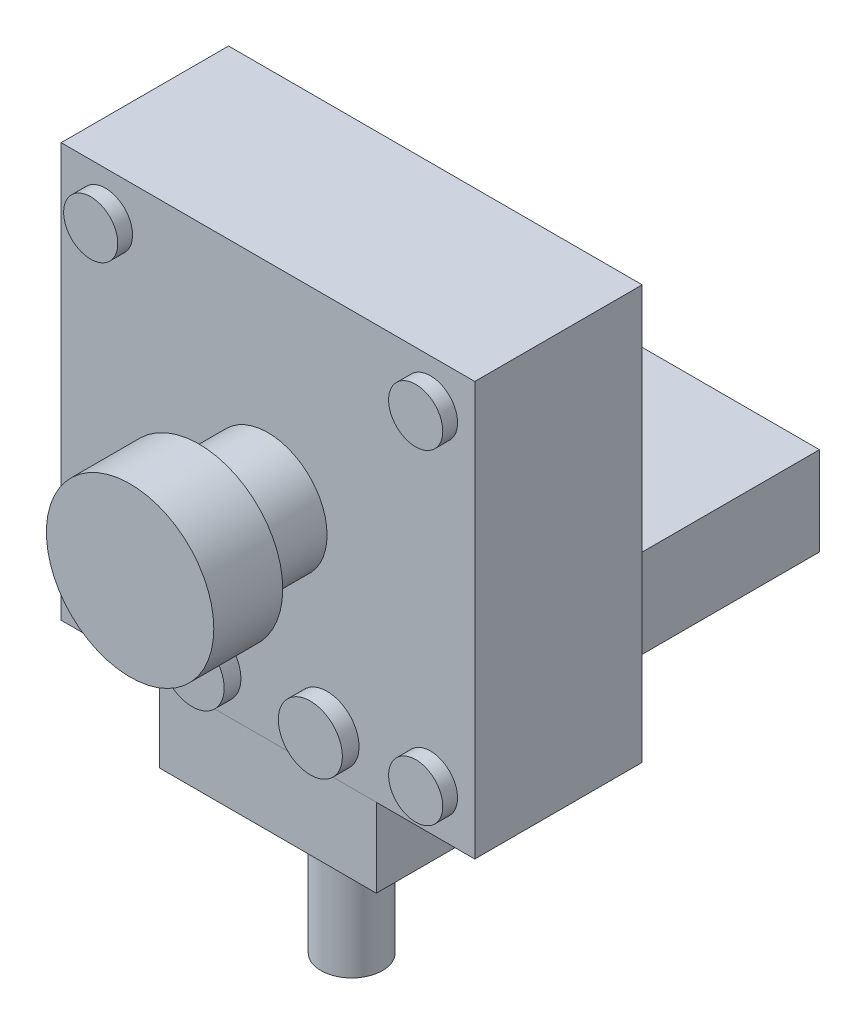
ISO-10303-21;
HEADER;
FILE_DESCRIPTION(('STEP AP214'),'2;1');
FILE_NAME('part.step','',(''),(''),'','','');
FILE_SCHEMA(('AUTOMOTIVE_DESIGN { 1 0 10303 214 1 1 1 1 }'));
ENDSEC;
DATA;
#1=APPLICATION_CONTEXT('core data for automotive mechanical design processes');
#2=APPLICATION_PROTOCOL_DEFINITION('international standard','automotive_design',2000,#1);
#3=PRODUCT_CONTEXT('',#1,'mechanical');
#4=PRODUCT('Part','Part','',(#3));
#5=PRODUCT_RELATED_PRODUCT_CATEGORY('part','',(#4));
#6=PRODUCT_DEFINITION_FORMATION('','',#4);
#7=PRODUCT_DEFINITION_CONTEXT('part definition',#1,'design');
#8=PRODUCT_DEFINITION('design','',#6,#7);
#9=PRODUCT_DEFINITION_SHAPE('','',#8);
#10=(LENGTH_UNIT() NAMED_UNIT(*) SI_UNIT(.MILLI.,.METRE.));
#11=(NAMED_UNIT(*) PLANE_ANGLE_UNIT() SI_UNIT($,.RADIAN.));
#12=(NAMED_UNIT(*) SI_UNIT($,.STERADIAN.) SOLID_ANGLE_UNIT());
#13=UNCERTAINTY_MEASURE_WITH_UNIT(LENGTH_MEASURE(1.E-05),#10,'distance_accuracy_value','');
#14=(GEOMETRIC_REPRESENTATION_CONTEXT(3) GLOBAL_UNCERTAINTY_ASSIGNED_CONTEXT((#13)) GLOBAL_UNIT_ASSIGNED_CONTEXT((#10,
#11,#12)) REPRESENTATION_CONTEXT('',''));
#15=CARTESIAN_POINT('',(0.,0.,0.));
#16=DIRECTION('',(0.,0.,1.));
#17=DIRECTION('',(1.,0.,0.));
#18=AXIS2_PLACEMENT_3D('',#15,#16,#17);
#19=CARTESIAN_POINT('',(30.5,2.75,-2.5));
#20=DIRECTION('',(-1.,0.,0.));
#21=DIRECTION('',(0.,0.,1.));
#22=AXIS2_PLACEMENT_3D('',#19,#20,#21);
#23=PLANE('',#22);
#24=DIRECTION('',(0.,-1.,0.));
#25=VECTOR('',#24,1.);
#26=CARTESIAN_POINT('',(30.5,2.75,0.));
#27=LINE('',#26,#25);
#28=CARTESIAN_POINT('',(30.5,6.25,0.));
#29=VERTEX_POINT('',#28);
#30=CARTESIAN_POINT('',(30.5,2.75,0.));
#31=VERTEX_POINT('',#30);
#32=EDGE_CURVE('E141',#29,#31,#27,.T.);
#33=ORIENTED_EDGE('',*,*,#32,.T.);
#34=DIRECTION('',(0.,0.,1.));
#35=VECTOR('',#34,1.);
#36=CARTESIAN_POINT('',(30.5,2.75,-2.5));
#37=LINE('',#36,#35);
#38=CARTESIAN_POINT('',(30.5,2.75,-2.5));
#39=VERTEX_POINT('',#38);
#40=EDGE_CURVE('E12',#39,#31,#37,.T.);
#41=ORIENTED_EDGE('',*,*,#40,.F.);
#42=DIRECTION('',(0.,-1.,0.));
#43=VECTOR('',#42,1.);
#44=CARTESIAN_POINT('',(30.5,2.75,-2.5));
#45=LINE('',#44,#43);
#46=CARTESIAN_POINT('',(30.5,6.25,-2.5));
#47=VERTEX_POINT('',#46);
#48=EDGE_CURVE('E150',#47,#39,#45,.T.);
#49=ORIENTED_EDGE('',*,*,#48,.F.);
#50=DIRECTION('',(0.,0.,1.));
#51=VECTOR('',#50,1.);
#52=CARTESIAN_POINT('',(30.5,6.25,-2.5));
#53=LINE('',#52,#51);
#54=EDGE_CURVE('E159',#47,#29,#53,.T.);
#55=ORIENTED_EDGE('',*,*,#54,.T.);
#56=EDGE_LOOP('',(#33,#41,#49,#55));
#57=FACE_BOUND('',#56,.T.);
#58=ADVANCED_FACE('F43',(#57),#23,.F.);
#59=CARTESIAN_POINT('',(30.5,2.75,-2.5));
#60=DIRECTION('',(0.,1.,0.));
#61=DIRECTION('',(0.,0.,1.));
#62=AXIS2_PLACEMENT_3D('',#59,#60,#61);
#63=PLANE('',#62);
#64=DIRECTION('',(-1.,0.,0.));
#65=VECTOR('',#64,1.);
#66=CARTESIAN_POINT('',(30.5,2.75,0.));
#67=LINE('',#66,#65);
#68=CARTESIAN_POINT('',(11.5,2.75,0.));
#69=VERTEX_POINT('',#68);
#70=EDGE_CURVE('E144',#31,#69,#67,.T.);
#71=ORIENTED_EDGE('',*,*,#70,.T.);
#72=DIRECTION('',(0.,0.,1.));
#73=VECTOR('',#72,1.);
#74=CARTESIAN_POINT('',(11.5,2.75,-2.5));
#75=LINE('',#74,#73);
#76=CARTESIAN_POINT('',(11.5,2.75,-2.5));
#77=VERTEX_POINT('',#76);
#78=EDGE_CURVE('E51',#77,#69,#75,.T.);
#79=ORIENTED_EDGE('',*,*,#78,.F.);
#80=DIRECTION('',(-1.,0.,0.));
#81=VECTOR('',#80,1.);
#82=CARTESIAN_POINT('',(30.5,2.75,-2.5));
#83=LINE('',#82,#81);
#84=EDGE_CURVE('E85',#39,#77,#83,.T.);
#85=ORIENTED_EDGE('',*,*,#84,.F.);
#86=ORIENTED_EDGE('',*,*,#40,.T.);
#87=EDGE_LOOP('',(#71,#79,#85,#86));
#88=FACE_BOUND('',#87,.T.);
#89=ADVANCED_FACE('F203',(#88),#63,.F.);
#90=CARTESIAN_POINT('',(11.5,2.75,-2.5));
#91=DIRECTION('',(1.,0.,0.));
#92=DIRECTION('',(0.,0.,-1.));
#93=AXIS2_PLACEMENT_3D('',#90,#91,#92);
#94=PLANE('',#93);
#95=DIRECTION('',(0.,1.,0.));
#96=VECTOR('',#95,1.);
#97=CARTESIAN_POINT('',(11.5,2.75,0.));
#98=LINE('',#97,#96);
#99=CARTESIAN_POINT('',(11.5,6.25,0.));
#100=VERTEX_POINT('',#99);
#101=EDGE_CURVE('E75',#69,#100,#98,.T.);
#102=ORIENTED_EDGE('',*,*,#101,.T.);
#103=DIRECTION('',(0.,0.,1.));
#104=VECTOR('',#103,1.);
#105=CARTESIAN_POINT('',(11.5,6.25,-2.5));
#106=LINE('',#105,#104);
#107=CARTESIAN_POINT('',(11.5,6.25,-2.5));
#108=VERTEX_POINT('',#107);
#109=EDGE_CURVE('E59',#108,#100,#106,.T.);
#110=ORIENTED_EDGE('',*,*,#109,.F.);
#111=DIRECTION('',(0.,1.,0.));
#112=VECTOR('',#111,1.);
#113=CARTESIAN_POINT('',(11.5,2.75,-2.5));
#114=LINE('',#113,#112);
#115=EDGE_CURVE('E154',#77,#108,#114,.T.);
#116=ORIENTED_EDGE('',*,*,#115,.F.);
#117=ORIENTED_EDGE('',*,*,#78,.T.);
#118=EDGE_LOOP('',(#102,#110,#116,#117));
#119=FACE_BOUND('',#118,.T.);
#120=ADVANCED_FACE('F165',(#119),#94,.F.);
#121=CARTESIAN_POINT('',(30.5,6.25,-2.5));
#122=DIRECTION('',(0.,-1.,0.));
#123=DIRECTION('',(0.,0.,-1.));
#124=AXIS2_PLACEMENT_3D('',#121,#122,#123);
#125=PLANE('',#124);
#126=DIRECTION('',(1.,0.,0.));
#127=VECTOR('',#126,1.);
#128=CARTESIAN_POINT('',(30.5,6.25,0.));
#129=LINE('',#128,#127);
#130=EDGE_CURVE('E80',#100,#29,#129,.T.);
#131=ORIENTED_EDGE('',*,*,#130,.T.);
#132=ORIENTED_EDGE('',*,*,#54,.F.);
#133=DIRECTION('',(1.,0.,0.));
#134=VECTOR('',#133,1.);
#135=CARTESIAN_POINT('',(30.5,6.25,-2.5));
#136=LINE('',#135,#134);
#137=EDGE_CURVE('E157',#108,#47,#136,.T.);
#138=ORIENTED_EDGE('',*,*,#137,.F.);
#139=ORIENTED_EDGE('',*,*,#109,.T.);
#140=EDGE_LOOP('',(#131,#132,#138,#139));
#141=FACE_BOUND('',#140,.T.);
#142=ADVANCED_FACE('F170',(#141),#125,.F.);
#143=CARTESIAN_POINT('',(0.,0.,0.));
#144=DIRECTION('',(0.,0.,1.));
#145=DIRECTION('',(1.,0.,0.));
#146=AXIS2_PLACEMENT_3D('',#143,#144,#145);
#147=PLANE('',#146);
#148=ORIENTED_EDGE('',*,*,#32,.F.);
#149=ORIENTED_EDGE('',*,*,#130,.F.);
#150=ORIENTED_EDGE('',*,*,#101,.F.);
#151=ORIENTED_EDGE('',*,*,#70,.F.);
#152=EDGE_LOOP('',(#148,#149,#150,#151));
#153=FACE_BOUND('',#152,.T.);
#154=ADVANCED_FACE('F168',(#153),#147,.T.);
#155=CARTESIAN_POINT('',(9.5,0.,-27.5));
#156=DIRECTION('',(1.,0.,0.));
#157=DIRECTION('',(0.,0.,-1.));
#158=AXIS2_PLACEMENT_3D('',#155,#156,#157);
#159=PLANE('',#158);
#160=DIRECTION('',(0.,1.,0.));
#161=VECTOR('',#160,1.);
#162=CARTESIAN_POINT('',(9.5,0.,-2.5));
#163=LINE('',#162,#161);
#164=CARTESIAN_POINT('',(9.5,0.,-2.5));
#165=VERTEX_POINT('',#164);
#166=CARTESIAN_POINT('',(9.5,8.99999999999999,-2.5));
#167=VERTEX_POINT('',#166);
#168=EDGE_CURVE('E140',#165,#167,#163,.T.);
#169=ORIENTED_EDGE('',*,*,#168,.T.);
#170=DIRECTION('',(0.,0.,1.));
#171=VECTOR('',#170,1.);
#172=CARTESIAN_POINT('',(9.5,8.99999999999999,-27.5));
#173=LINE('',#172,#171);
#174=CARTESIAN_POINT('',(9.5,8.99999999999999,-27.5));
#175=VERTEX_POINT('',#174);
#176=EDGE_CURVE('E120',#175,#167,#173,.T.);
#177=ORIENTED_EDGE('',*,*,#176,.F.);
#178=DIRECTION('',(0.,1.,0.));
#179=VECTOR('',#178,1.);
#180=CARTESIAN_POINT('',(9.5,0.,-27.5));
#181=LINE('',#180,#179);
#182=CARTESIAN_POINT('',(9.5,0.,-27.5));
#183=VERTEX_POINT('',#182);
#184=EDGE_CURVE('E127',#183,#175,#181,.T.);
#185=ORIENTED_EDGE('',*,*,#184,.F.);
#186=DIRECTION('',(0.,0.,1.));
#187=VECTOR('',#186,1.);
#188=CARTESIAN_POINT('',(9.5,0.,-27.5));
#189=LINE('',#188,#187);
#190=EDGE_CURVE('E187',#183,#165,#189,.T.);
#191=ORIENTED_EDGE('',*,*,#190,.T.);
#192=EDGE_LOOP('',(#169,#177,#185,#191));
#193=FACE_BOUND('',#192,.T.);
#194=ADVANCED_FACE('F138',(#193),#159,.F.);
#195=CARTESIAN_POINT('',(32.5,8.99999999999999,-27.5));
#196=DIRECTION('',(0.,-1.,0.));
#197=DIRECTION('',(0.,0.,-1.));
#198=AXIS2_PLACEMENT_3D('',#195,#196,#197);
#199=PLANE('',#198);
#200=DIRECTION('',(1.,0.,0.));
#201=VECTOR('',#200,1.);
#202=CARTESIAN_POINT('',(32.5,8.99999999999999,-2.5));
#203=LINE('',#202,#201);
#204=CARTESIAN_POINT('',(32.5,8.99999999999999,-2.5));
#205=VERTEX_POINT('',#204);
#206=EDGE_CURVE('E178',#167,#205,#203,.T.);
#207=ORIENTED_EDGE('',*,*,#206,.T.);
#208=DIRECTION('',(0.,0.,1.));
#209=VECTOR('',#208,1.);
#210=CARTESIAN_POINT('',(32.5,8.99999999999999,-27.5));
#211=LINE('',#210,#209);
#212=CARTESIAN_POINT('',(32.5,8.99999999999999,-27.5));
#213=VERTEX_POINT('',#212);
#214=EDGE_CURVE('E123',#213,#205,#211,.T.);
#215=ORIENTED_EDGE('',*,*,#214,.F.);
#216=DIRECTION('',(1.,0.,0.));
#217=VECTOR('',#216,1.);
#218=CARTESIAN_POINT('',(32.5,8.99999999999999,-27.5));
#219=LINE('',#218,#217);
#220=EDGE_CURVE('E116',#175,#213,#219,.T.);
#221=ORIENTED_EDGE('',*,*,#220,.F.);
#222=ORIENTED_EDGE('',*,*,#176,.T.);
#223=EDGE_LOOP('',(#207,#215,#221,#222));
#224=FACE_BOUND('',#223,.T.);
#225=ADVANCED_FACE('F118',(#224),#199,.F.);
#226=CARTESIAN_POINT('',(32.5,0.,-27.5));
#227=DIRECTION('',(-1.,0.,0.));
#228=DIRECTION('',(0.,0.,1.));
#229=AXIS2_PLACEMENT_3D('',#226,#227,#228);
#230=PLANE('',#229);
#231=DIRECTION('',(0.,-1.,0.));
#232=VECTOR('',#231,1.);
#233=CARTESIAN_POINT('',(32.5,0.,-2.5));
#234=LINE('',#233,#232);
#235=CARTESIAN_POINT('',(32.5,0.,-2.5));
#236=VERTEX_POINT('',#235);
#237=EDGE_CURVE('E180',#205,#236,#234,.T.);
#238=ORIENTED_EDGE('',*,*,#237,.T.);
#239=DIRECTION('',(0.,0.,1.));
#240=VECTOR('',#239,1.);
#241=CARTESIAN_POINT('',(32.5,0.,-27.5));
#242=LINE('',#241,#240);
#243=CARTESIAN_POINT('',(32.5,0.,-27.5));
#244=VERTEX_POINT('',#243);
#245=EDGE_CURVE('E146',#244,#236,#242,.T.);
#246=ORIENTED_EDGE('',*,*,#245,.F.);
#247=DIRECTION('',(0.,-1.,0.));
#248=VECTOR('',#247,1.);
#249=CARTESIAN_POINT('',(32.5,0.,-27.5));
#250=LINE('',#249,#248);
#251=EDGE_CURVE('E126',#213,#244,#250,.T.);
#252=ORIENTED_EDGE('',*,*,#251,.F.);
#253=ORIENTED_EDGE('',*,*,#214,.T.);
#254=EDGE_LOOP('',(#238,#246,#252,#253));
#255=FACE_BOUND('',#254,.T.);
#256=ADVANCED_FACE('F193',(#255),#230,.F.);
#257=CARTESIAN_POINT('',(32.5,0.,-27.5));
#258=DIRECTION('',(0.,1.,0.));
#259=DIRECTION('',(0.,0.,1.));
#260=AXIS2_PLACEMENT_3D('',#257,#258,#259);
#261=PLANE('',#260);
#262=DIRECTION('',(-1.,0.,0.));
#263=VECTOR('',#262,1.);
#264=CARTESIAN_POINT('',(32.5,0.,-2.5));
#265=LINE('',#264,#263);
#266=EDGE_CURVE('E136',#236,#165,#265,.T.);
#267=ORIENTED_EDGE('',*,*,#266,.T.);
#268=ORIENTED_EDGE('',*,*,#190,.F.);
#269=DIRECTION('',(-1.,0.,0.));
#270=VECTOR('',#269,1.);
#271=CARTESIAN_POINT('',(32.5,0.,-27.5));
#272=LINE('',#271,#270);
#273=EDGE_CURVE('E132',#244,#183,#272,.T.);
#274=ORIENTED_EDGE('',*,*,#273,.F.);
#275=ORIENTED_EDGE('',*,*,#245,.T.);
#276=EDGE_LOOP('',(#267,#268,#274,#275));
#277=FACE_BOUND('',#276,.T.);
#278=ADVANCED_FACE('F191',(#277),#261,.F.);
#279=CARTESIAN_POINT('',(0.,0.,-27.5));
#280=DIRECTION('',(0.,0.,1.));
#281=DIRECTION('',(1.,0.,0.));
#282=AXIS2_PLACEMENT_3D('',#279,#280,#281);
#283=PLANE('',#282);
#284=ORIENTED_EDGE('',*,*,#184,.T.);
#285=ORIENTED_EDGE('',*,*,#220,.T.);
#286=ORIENTED_EDGE('',*,*,#251,.T.);
#287=ORIENTED_EDGE('',*,*,#273,.T.);
#288=EDGE_LOOP('',(#284,#285,#286,#287));
#289=FACE_BOUND('',#288,.T.);
#290=ADVANCED_FACE('F130',(#289),#283,.F.);
#291=CARTESIAN_POINT('',(0.,0.,-2.5));
#292=DIRECTION('',(0.,0.,1.));
#293=DIRECTION('',(1.,0.,0.));
#294=AXIS2_PLACEMENT_3D('',#291,#292,#293);
#295=PLANE('',#294);
#296=ORIENTED_EDGE('',*,*,#137,.T.);
#297=ORIENTED_EDGE('',*,*,#48,.T.);
#298=ORIENTED_EDGE('',*,*,#84,.T.);
#299=ORIENTED_EDGE('',*,*,#115,.T.);
#300=EDGE_LOOP('',(#296,#297,#298,#299));
#301=FACE_BOUND('',#300,.T.);
#302=ORIENTED_EDGE('',*,*,#168,.F.);
#303=ORIENTED_EDGE('',*,*,#266,.F.);
#304=ORIENTED_EDGE('',*,*,#237,.F.);
#305=ORIENTED_EDGE('',*,*,#206,.F.);
#306=EDGE_LOOP('',(#302,#303,#304,#305));
#307=FACE_BOUND('',#306,.T.);
#308=ADVANCED_FACE('F172',(#301,#307),#295,.T.);
#309=CLOSED_SHELL('',(#58,#89,#120,#142,#154,#194,#225,#256,#278,#290,#308));
#310=MANIFOLD_SOLID_BREP('B2',#309);
#311=CARTESIAN_POINT('',(10.,-8.,17.));
#312=DIRECTION('',(1.,0.,0.));
#313=DIRECTION('',(0.,0.,-1.));
#314=AXIS2_PLACEMENT_3D('',#311,#312,#313);
#315=PLANE('',#314);
#316=DIRECTION('',(0.,0.,-1.));
#317=VECTOR('',#316,1.);
#318=CARTESIAN_POINT('',(10.,0.,17.));
#319=LINE('',#318,#317);
#320=CARTESIAN_POINT('',(10.,0.,17.));
#321=VERTEX_POINT('',#320);
#322=CARTESIAN_POINT('',(10.,0.,0.));
#323=VERTEX_POINT('',#322);
#324=EDGE_CURVE('E355',#321,#323,#319,.T.);
#325=ORIENTED_EDGE('',*,*,#324,.T.);
#326=DIRECTION('',(0.,1.,0.));
#327=VECTOR('',#326,1.);
#328=CARTESIAN_POINT('',(10.,-8.,0.));
#329=LINE('',#328,#327);
#330=CARTESIAN_POINT('',(10.,-8.,0.));
#331=VERTEX_POINT('',#330);
#332=EDGE_CURVE('E292',#331,#323,#329,.T.);
#333=ORIENTED_EDGE('',*,*,#332,.F.);
#334=DIRECTION('',(0.,0.,-1.));
#335=VECTOR('',#334,1.);
#336=CARTESIAN_POINT('',(10.,-8.,17.));
#337=LINE('',#336,#335);
#338=CARTESIAN_POINT('',(10.,-8.,17.));
#339=VERTEX_POINT('',#338);
#340=EDGE_CURVE('E342',#339,#331,#337,.T.);
#341=ORIENTED_EDGE('',*,*,#340,.F.);
#342=DIRECTION('',(0.,1.,0.));
#343=VECTOR('',#342,1.);
#344=CARTESIAN_POINT('',(10.,-8.,17.));
#345=LINE('',#344,#343);
#346=EDGE_CURVE('E351',#339,#321,#345,.T.);
#347=ORIENTED_EDGE('',*,*,#346,.T.);
#348=EDGE_LOOP('',(#325,#333,#341,#347));
#349=FACE_BOUND('',#348,.T.);
#350=ADVANCED_FACE('F289',(#349),#315,.F.);
#351=CARTESIAN_POINT('',(10.,-8.,0.));
#352=DIRECTION('',(0.,0.,1.));
#353=DIRECTION('',(1.,0.,0.));
#354=AXIS2_PLACEMENT_3D('',#351,#352,#353);
#355=PLANE('',#354);
#356=DIRECTION('',(1.,0.,0.));
#357=VECTOR('',#356,1.);
#358=CARTESIAN_POINT('',(10.,0.,0.));
#359=LINE('',#358,#357);
#360=CARTESIAN_POINT('',(32.,0.,0.));
#361=VERTEX_POINT('',#360);
#362=EDGE_CURVE('E347',#323,#361,#359,.T.);
#363=ORIENTED_EDGE('',*,*,#362,.T.);
#364=DIRECTION('',(0.,1.,0.));
#365=VECTOR('',#364,1.);
#366=CARTESIAN_POINT('',(32.,-8.,0.));
#367=LINE('',#366,#365);
#368=CARTESIAN_POINT('',(32.,-8.,0.));
#369=VERTEX_POINT('',#368);
#370=EDGE_CURVE('E345',#369,#361,#367,.T.);
#371=ORIENTED_EDGE('',*,*,#370,.F.);
#372=DIRECTION('',(1.,0.,0.));
#373=VECTOR('',#372,1.);
#374=CARTESIAN_POINT('',(10.,-8.,0.));
#375=LINE('',#374,#373);
#376=EDGE_CURVE('E337',#331,#369,#375,.T.);
#377=ORIENTED_EDGE('',*,*,#376,.F.);
#378=ORIENTED_EDGE('',*,*,#332,.T.);
#379=EDGE_LOOP('',(#363,#371,#377,#378));
#380=FACE_BOUND('',#379,.T.);
#381=ADVANCED_FACE('F346',(#380),#355,.F.);
#382=CARTESIAN_POINT('',(32.,-8.,17.));
#383=DIRECTION('',(-1.,0.,0.));
#384=DIRECTION('',(0.,0.,1.));
#385=AXIS2_PLACEMENT_3D('',#382,#383,#384);
#386=PLANE('',#385);
#387=DIRECTION('',(0.,0.,1.));
#388=VECTOR('',#387,1.);
#389=CARTESIAN_POINT('',(32.,0.,17.));
#390=LINE('',#389,#388);
#391=CARTESIAN_POINT('',(32.,0.,17.));
#392=VERTEX_POINT('',#391);
#393=EDGE_CURVE('E323',#361,#392,#390,.T.);
#394=ORIENTED_EDGE('',*,*,#393,.T.);
#395=DIRECTION('',(0.,1.,0.));
#396=VECTOR('',#395,1.);
#397=CARTESIAN_POINT('',(32.,-8.,17.));
#398=LINE('',#397,#396);
#399=CARTESIAN_POINT('',(32.,-8.,17.));
#400=VERTEX_POINT('',#399);
#401=EDGE_CURVE('E348',#400,#392,#398,.T.);
#402=ORIENTED_EDGE('',*,*,#401,.F.);
#403=DIRECTION('',(0.,0.,1.));
#404=VECTOR('',#403,1.);
#405=CARTESIAN_POINT('',(32.,-8.,17.));
#406=LINE('',#405,#404);
#407=EDGE_CURVE('E340',#369,#400,#406,.T.);
#408=ORIENTED_EDGE('',*,*,#407,.F.);
#409=ORIENTED_EDGE('',*,*,#370,.T.);
#410=EDGE_LOOP('',(#394,#402,#408,#409));
#411=FACE_BOUND('',#410,.T.);
#412=ADVANCED_FACE('F349',(#411),#386,.F.);
#413=CARTESIAN_POINT('',(10.,-8.,17.));
#414=DIRECTION('',(0.,0.,-1.));
#415=DIRECTION('',(-1.,0.,0.));
#416=AXIS2_PLACEMENT_3D('',#413,#414,#415);
#417=PLANE('',#416);
#418=DIRECTION('',(-1.,0.,0.));
#419=VECTOR('',#418,1.);
#420=CARTESIAN_POINT('',(10.,0.,17.));
#421=LINE('',#420,#419);
#422=EDGE_CURVE('E329',#392,#321,#421,.T.);
#423=ORIENTED_EDGE('',*,*,#422,.T.);
#424=ORIENTED_EDGE('',*,*,#346,.F.);
#425=DIRECTION('',(-1.,0.,0.));
#426=VECTOR('',#425,1.);
#427=CARTESIAN_POINT('',(10.,-8.,17.));
#428=LINE('',#427,#426);
#429=EDGE_CURVE('E306',#400,#339,#428,.T.);
#430=ORIENTED_EDGE('',*,*,#429,.F.);
#431=ORIENTED_EDGE('',*,*,#401,.T.);
#432=EDGE_LOOP('',(#423,#424,#430,#431));
#433=FACE_BOUND('',#432,.T.);
#434=ADVANCED_FACE('F363',(#433),#417,.F.);
#435=CARTESIAN_POINT('',(0.,-8.,0.));
#436=DIRECTION('',(0.,-1.,0.));
#437=DIRECTION('',(0.,0.,-1.));
#438=AXIS2_PLACEMENT_3D('',#435,#436,#437);
#439=PLANE('',#438);
#440=CARTESIAN_POINT('',(21.,-8.,8.5));
#441=DIRECTION('',(0.,-1.,0.));
#442=DIRECTION('',(0.,0.,-1.));
#443=AXIS2_PLACEMENT_3D('',#440,#441,#442);
#444=CIRCLE('',#443,3.125);
#445=CARTESIAN_POINT('',(21.,-8.,5.375));
#446=VERTEX_POINT('',#445);
#447=EDGE_CURVE('E41',#446,#446,#444,.T.);
#448=ORIENTED_EDGE('',*,*,#447,.F.);
#449=EDGE_LOOP('',(#448));
#450=FACE_BOUND('',#449,.T.);
#451=ORIENTED_EDGE('',*,*,#340,.T.);
#452=ORIENTED_EDGE('',*,*,#376,.T.);
#453=ORIENTED_EDGE('',*,*,#407,.T.);
#454=ORIENTED_EDGE('',*,*,#429,.T.);
#455=EDGE_LOOP('',(#451,#452,#453,#454));
#456=FACE_BOUND('',#455,.T.);
#457=ADVANCED_FACE('F338',(#450,#456),#439,.T.);
#458=CARTESIAN_POINT('',(0.,0.,0.));
#459=DIRECTION('',(0.,-1.,0.));
#460=DIRECTION('',(0.,0.,-1.));
#461=AXIS2_PLACEMENT_3D('',#458,#459,#460);
#462=PLANE('',#461);
#463=ORIENTED_EDGE('',*,*,#324,.F.);
#464=ORIENTED_EDGE('',*,*,#422,.F.);
#465=ORIENTED_EDGE('',*,*,#393,.F.);
#466=ORIENTED_EDGE('',*,*,#362,.F.);
#467=EDGE_LOOP('',(#463,#464,#465,#466));
#468=FACE_BOUND('',#467,.T.);
#469=ADVANCED_FACE('F366',(#468),#462,.F.);
#470=CARTESIAN_POINT('',(21.,-23.,8.5));
#471=DIRECTION('',(0.,1.,0.));
#472=DIRECTION('',(0.,0.,1.));
#473=AXIS2_PLACEMENT_3D('',#470,#471,#472);
#474=CYLINDRICAL_SURFACE('',#473,3.125);
#475=CARTESIAN_POINT('',(21.,-23.,8.5));
#476=DIRECTION('',(0.,-1.,0.));
#477=DIRECTION('',(0.,0.,-1.));
#478=AXIS2_PLACEMENT_3D('',#475,#476,#477);
#479=CIRCLE('',#478,3.125);
#480=CARTESIAN_POINT('',(21.,-23.,5.375));
#481=VERTEX_POINT('',#480);
#482=EDGE_CURVE('E358',#481,#481,#479,.T.);
#483=ORIENTED_EDGE('',*,*,#482,.F.);
#484=EDGE_LOOP('',(#483));
#485=FACE_BOUND('',#484,.T.);
#486=ORIENTED_EDGE('',*,*,#447,.T.);
#487=EDGE_LOOP('',(#486));
#488=FACE_BOUND('',#487,.T.);
#489=ADVANCED_FACE('F374',(#485,#488),#474,.T.);
#490=CARTESIAN_POINT('',(21.,-23.,8.5));
#491=DIRECTION('',(0.,-1.,0.));
#492=DIRECTION('',(0.,0.,-1.));
#493=AXIS2_PLACEMENT_3D('',#490,#491,#492);
#494=PLANE('',#493);
#495=ORIENTED_EDGE('',*,*,#482,.T.);
#496=EDGE_LOOP('',(#495));
#497=FACE_BOUND('',#496,.T.);
#498=ADVANCED_FACE('F372',(#497),#494,.T.);
#499=CLOSED_SHELL('',(#350,#381,#412,#434,#457,#469,#489,#498));
#500=MANIFOLD_SOLID_BREP('B6',#499);
#501=CARTESIAN_POINT('',(21.,21.,31.));
#502=DIRECTION('',(0.,0.,-1.));
#503=DIRECTION('',(-1.,0.,0.));
#504=AXIS2_PLACEMENT_3D('',#501,#502,#503);
#505=CYLINDRICAL_SURFACE('',#504,8.5);
#506=CARTESIAN_POINT('',(21.,21.,31.));
#507=DIRECTION('',(0.,0.,1.));
#508=DIRECTION('',(1.,0.,0.));
#509=AXIS2_PLACEMENT_3D('',#506,#507,#508);
#510=CIRCLE('',#509,8.5);
#511=CARTESIAN_POINT('',(29.5,21.,31.));
#512=VERTEX_POINT('',#511);
#513=EDGE_CURVE('E288',#512,#512,#510,.T.);
#514=ORIENTED_EDGE('',*,*,#513,.F.);
#515=EDGE_LOOP('',(#514));
#516=FACE_BOUND('',#515,.T.);
#517=CARTESIAN_POINT('',(21.,21.,24.));
#518=DIRECTION('',(0.,0.,1.));
#519=DIRECTION('',(1.,0.,0.));
#520=AXIS2_PLACEMENT_3D('',#517,#518,#519);
#521=CIRCLE('',#520,8.5);
#522=CARTESIAN_POINT('',(29.5,21.,24.));
#523=VERTEX_POINT('',#522);
#524=EDGE_CURVE('E453',#523,#523,#521,.T.);
#525=ORIENTED_EDGE('',*,*,#524,.T.);
#526=EDGE_LOOP('',(#525));
#527=FACE_BOUND('',#526,.T.);
#528=ADVANCED_FACE('F450',(#516,#527),#505,.T.);
#529=CARTESIAN_POINT('',(21.,21.,31.));
#530=DIRECTION('',(0.,0.,1.));
#531=DIRECTION('',(1.,0.,0.));
#532=AXIS2_PLACEMENT_3D('',#529,#530,#531);
#533=PLANE('',#532);
#534=ORIENTED_EDGE('',*,*,#513,.T.);
#535=EDGE_LOOP('',(#534));
#536=FACE_BOUND('',#535,.T.);
#537=ADVANCED_FACE('F465',(#536),#533,.T.);
#538=CARTESIAN_POINT('',(21.,21.,24.));
#539=DIRECTION('',(0.,0.,1.));
#540=DIRECTION('',(1.,0.,0.));
#541=AXIS2_PLACEMENT_3D('',#538,#539,#540);
#542=PLANE('',#541);
#543=ORIENTED_EDGE('',*,*,#524,.F.);
#544=EDGE_LOOP('',(#543));
#545=FACE_BOUND('',#544,.T.);
#546=ADVANCED_FACE('F463',(#545),#542,.F.);
#547=CLOSED_SHELL('',(#528,#537,#546));
#548=MANIFOLD_SOLID_BREP('B35',#547);
#549=CARTESIAN_POINT('',(21.,21.,24.));
#550=DIRECTION('',(0.,0.,-1.));
#551=DIRECTION('',(-1.,0.,0.));
#552=AXIS2_PLACEMENT_3D('',#549,#550,#551);
#553=CYLINDRICAL_SURFACE('',#552,6.);
#554=CARTESIAN_POINT('',(21.,21.,24.));
#555=DIRECTION('',(0.,0.,1.));
#556=DIRECTION('',(1.,0.,0.));
#557=AXIS2_PLACEMENT_3D('',#554,#555,#556);
#558=CIRCLE('',#557,6.);
#559=CARTESIAN_POINT('',(27.,21.,24.));
#560=VERTEX_POINT('',#559);
#561=EDGE_CURVE('E449',#560,#560,#558,.T.);
#562=ORIENTED_EDGE('',*,*,#561,.F.);
#563=EDGE_LOOP('',(#562));
#564=FACE_BOUND('',#563,.T.);
#565=CARTESIAN_POINT('',(21.,21.,17.));
#566=DIRECTION('',(0.,0.,1.));
#567=DIRECTION('',(1.,0.,0.));
#568=AXIS2_PLACEMENT_3D('',#565,#566,#567);
#569=CIRCLE('',#568,6.);
#570=CARTESIAN_POINT('',(27.,21.,17.));
#571=VERTEX_POINT('',#570);
#572=EDGE_CURVE('E503',#571,#571,#569,.T.);
#573=ORIENTED_EDGE('',*,*,#572,.T.);
#574=EDGE_LOOP('',(#573));
#575=FACE_BOUND('',#574,.T.);
#576=ADVANCED_FACE('F500',(#564,#575),#553,.T.);
#577=CARTESIAN_POINT('',(21.,21.,24.));
#578=DIRECTION('',(0.,0.,1.));
#579=DIRECTION('',(1.,0.,0.));
#580=AXIS2_PLACEMENT_3D('',#577,#578,#579);
#581=PLANE('',#580);
#582=ORIENTED_EDGE('',*,*,#561,.T.);
#583=EDGE_LOOP('',(#582));
#584=FACE_BOUND('',#583,.T.);
#585=ADVANCED_FACE('F515',(#584),#581,.T.);
#586=CARTESIAN_POINT('',(21.,21.,17.));
#587=DIRECTION('',(0.,0.,1.));
#588=DIRECTION('',(1.,0.,0.));
#589=AXIS2_PLACEMENT_3D('',#586,#587,#588);
#590=PLANE('',#589);
#591=ORIENTED_EDGE('',*,*,#572,.F.);
#592=EDGE_LOOP('',(#591));
#593=FACE_BOUND('',#592,.T.);
#594=ADVANCED_FACE('F513',(#593),#590,.F.);
#595=CLOSED_SHELL('',(#576,#585,#594));
#596=MANIFOLD_SOLID_BREP('B283',#595);
#597=CARTESIAN_POINT('',(0.,0.,17.));
#598=DIRECTION('',(1.,0.,0.));
#599=DIRECTION('',(0.,0.,-1.));
#600=AXIS2_PLACEMENT_3D('',#597,#598,#599);
#601=PLANE('',#600);
#602=DIRECTION('',(0.,-1.,0.));
#603=VECTOR('',#602,1.);
#604=CARTESIAN_POINT('',(0.,0.,0.));
#605=LINE('',#604,#603);
#606=CARTESIAN_POINT('',(0.,42.,0.));
#607=VERTEX_POINT('',#606);
#608=CARTESIAN_POINT('',(0.,0.,0.));
#609=VERTEX_POINT('',#608);
#610=EDGE_CURVE('E608',#607,#609,#605,.T.);
#611=ORIENTED_EDGE('',*,*,#610,.T.);
#612=DIRECTION('',(0.,0.,-1.));
#613=VECTOR('',#612,1.);
#614=CARTESIAN_POINT('',(0.,0.,17.));
#615=LINE('',#614,#613);
#616=CARTESIAN_POINT('',(0.,0.,17.));
#617=VERTEX_POINT('',#616);
#618=EDGE_CURVE('E599',#617,#609,#615,.T.);
#619=ORIENTED_EDGE('',*,*,#618,.F.);
#620=DIRECTION('',(0.,-1.,0.));
#621=VECTOR('',#620,1.);
#622=CARTESIAN_POINT('',(0.,0.,17.));
#623=LINE('',#622,#621);
#624=CARTESIAN_POINT('',(0.,42.,17.));
#625=VERTEX_POINT('',#624);
#626=EDGE_CURVE('E593',#625,#617,#623,.T.);
#627=ORIENTED_EDGE('',*,*,#626,.F.);
#628=DIRECTION('',(0.,0.,-1.));
#629=VECTOR('',#628,1.);
#630=CARTESIAN_POINT('',(0.,42.,17.));
#631=LINE('',#630,#629);
#632=EDGE_CURVE('E604',#625,#607,#631,.T.);
#633=ORIENTED_EDGE('',*,*,#632,.T.);
#634=EDGE_LOOP('',(#611,#619,#627,#633));
#635=FACE_BOUND('',#634,.T.);
#636=ADVANCED_FACE('F541',(#635),#601,.F.);
#637=CARTESIAN_POINT('',(0.,0.,17.));
#638=DIRECTION('',(0.,1.,0.));
#639=DIRECTION('',(0.,0.,1.));
#640=AXIS2_PLACEMENT_3D('',#637,#638,#639);
#641=PLANE('',#640);
#642=DIRECTION('',(1.,0.,0.));
#643=VECTOR('',#642,1.);
#644=CARTESIAN_POINT('',(0.,0.,0.));
#645=LINE('',#644,#643);
#646=CARTESIAN_POINT('',(42.,0.,0.));
#647=VERTEX_POINT('',#646);
#648=EDGE_CURVE('E598',#609,#647,#645,.T.);
#649=ORIENTED_EDGE('',*,*,#648,.T.);
#650=DIRECTION('',(0.,0.,-1.));
#651=VECTOR('',#650,1.);
#652=CARTESIAN_POINT('',(42.,0.,17.));
#653=LINE('',#652,#651);
#654=CARTESIAN_POINT('',(42.,0.,17.));
#655=VERTEX_POINT('',#654);
#656=EDGE_CURVE('E596',#655,#647,#653,.T.);
#657=ORIENTED_EDGE('',*,*,#656,.F.);
#658=DIRECTION('',(1.,0.,0.));
#659=VECTOR('',#658,1.);
#660=CARTESIAN_POINT('',(0.,0.,17.));
#661=LINE('',#660,#659);
#662=EDGE_CURVE('E588',#617,#655,#661,.T.);
#663=ORIENTED_EDGE('',*,*,#662,.F.);
#664=ORIENTED_EDGE('',*,*,#618,.T.);
#665=EDGE_LOOP('',(#649,#657,#663,#664));
#666=FACE_BOUND('',#665,.T.);
#667=ADVANCED_FACE('F597',(#666),#641,.F.);
#668=CARTESIAN_POINT('',(42.,0.,17.));
#669=DIRECTION('',(-1.,0.,0.));
#670=DIRECTION('',(0.,-1.,0.));
#671=AXIS2_PLACEMENT_3D('',#668,#669,#670);
#672=PLANE('',#671);
#673=DIRECTION('',(0.,1.,0.));
#674=VECTOR('',#673,1.);
#675=CARTESIAN_POINT('',(42.,0.,0.));
#676=LINE('',#675,#674);
#677=CARTESIAN_POINT('',(42.,42.,0.));
#678=VERTEX_POINT('',#677);
#679=EDGE_CURVE('E574',#647,#678,#676,.T.);
#680=ORIENTED_EDGE('',*,*,#679,.T.);
#681=DIRECTION('',(0.,0.,-1.));
#682=VECTOR('',#681,1.);
#683=CARTESIAN_POINT('',(42.,42.,17.));
#684=LINE('',#683,#682);
#685=CARTESIAN_POINT('',(42.,42.,17.));
#686=VERTEX_POINT('',#685);
#687=EDGE_CURVE('E600',#686,#678,#684,.T.);
#688=ORIENTED_EDGE('',*,*,#687,.F.);
#689=DIRECTION('',(0.,1.,0.));
#690=VECTOR('',#689,1.);
#691=CARTESIAN_POINT('',(42.,0.,17.));
#692=LINE('',#691,#690);
#693=EDGE_CURVE('E591',#655,#686,#692,.T.);
#694=ORIENTED_EDGE('',*,*,#693,.F.);
#695=ORIENTED_EDGE('',*,*,#656,.T.);
#696=EDGE_LOOP('',(#680,#688,#694,#695));
#697=FACE_BOUND('',#696,.T.);
#698=ADVANCED_FACE('F602',(#697),#672,.F.);
#699=CARTESIAN_POINT('',(0.,42.,17.));
#700=DIRECTION('',(0.,-1.,0.));
#701=DIRECTION('',(0.,0.,-1.));
#702=AXIS2_PLACEMENT_3D('',#699,#700,#701);
#703=PLANE('',#702);
#704=DIRECTION('',(-1.,0.,0.));
#705=VECTOR('',#704,1.);
#706=CARTESIAN_POINT('',(0.,42.,0.));
#707=LINE('',#706,#705);
#708=EDGE_CURVE('E580',#678,#607,#707,.T.);
#709=ORIENTED_EDGE('',*,*,#708,.T.);
#710=ORIENTED_EDGE('',*,*,#632,.F.);
#711=DIRECTION('',(-1.,0.,0.));
#712=VECTOR('',#711,1.);
#713=CARTESIAN_POINT('',(0.,42.,17.));
#714=LINE('',#713,#712);
#715=EDGE_CURVE('E557',#686,#625,#714,.T.);
#716=ORIENTED_EDGE('',*,*,#715,.F.);
#717=ORIENTED_EDGE('',*,*,#687,.T.);
#718=EDGE_LOOP('',(#709,#710,#716,#717));
#719=FACE_BOUND('',#718,.T.);
#720=ADVANCED_FACE('F637',(#719),#703,.F.);
#721=CARTESIAN_POINT('',(0.,0.,17.));
#722=DIRECTION('',(0.,0.,-1.));
#723=DIRECTION('',(-1.,0.,0.));
#724=AXIS2_PLACEMENT_3D('',#721,#722,#723);
#725=PLANE('',#724);
#726=CARTESIAN_POINT('',(27.,4.,17.));
#727=DIRECTION('',(0.,0.,-1.));
#728=DIRECTION('',(-1.,0.,0.));
#729=AXIS2_PLACEMENT_3D('',#726,#727,#728);
#730=CIRCLE('',#729,3.25);
#731=CARTESIAN_POINT('',(23.75,4.,17.));
#732=VERTEX_POINT('',#731);
#733=EDGE_CURVE('E498',#732,#732,#730,.F.);
#734=ORIENTED_EDGE('',*,*,#733,.F.);
#735=EDGE_LOOP('',(#734));
#736=FACE_BOUND('',#735,.T.);
#737=CARTESIAN_POINT('',(15.,4.,17.));
#738=DIRECTION('',(0.,0.,-1.));
#739=DIRECTION('',(-1.,0.,0.));
#740=AXIS2_PLACEMENT_3D('',#737,#738,#739);
#741=CIRCLE('',#740,3.25);
#742=CARTESIAN_POINT('',(11.75,4.,17.));
#743=VERTEX_POINT('',#742);
#744=EDGE_CURVE('E549',#743,#743,#741,.F.);
#745=ORIENTED_EDGE('',*,*,#744,.F.);
#746=EDGE_LOOP('',(#745));
#747=FACE_BOUND('',#746,.T.);
#748=CARTESIAN_POINT('',(4.50000000000001,37.5,17.));
#749=DIRECTION('',(0.,0.,-1.));
#750=DIRECTION('',(-1.,0.,0.));
#751=AXIS2_PLACEMENT_3D('',#748,#749,#750);
#752=CIRCLE('',#751,2.75);
#753=CARTESIAN_POINT('',(1.75,37.5,17.));
#754=VERTEX_POINT('',#753);
#755=EDGE_CURVE('E643',#754,#754,#752,.T.);
#756=ORIENTED_EDGE('',*,*,#755,.T.);
#757=EDGE_LOOP('',(#756));
#758=FACE_BOUND('',#757,.T.);
#759=CARTESIAN_POINT('',(37.5,37.5,17.));
#760=DIRECTION('',(0.,0.,-1.));
#761=DIRECTION('',(-1.,0.,0.));
#762=AXIS2_PLACEMENT_3D('',#759,#760,#761);
#763=CIRCLE('',#762,2.75000000000001);
#764=CARTESIAN_POINT('',(34.75,37.5,17.));
#765=VERTEX_POINT('',#764);
#766=EDGE_CURVE('E647',#765,#765,#763,.T.);
#767=ORIENTED_EDGE('',*,*,#766,.T.);
#768=EDGE_LOOP('',(#767));
#769=FACE_BOUND('',#768,.T.);
#770=CARTESIAN_POINT('',(37.5,4.50000000000003,17.));
#771=DIRECTION('',(0.,0.,-1.));
#772=DIRECTION('',(-1.,0.,0.));
#773=AXIS2_PLACEMENT_3D('',#770,#771,#772);
#774=CIRCLE('',#773,2.75000000000001);
#775=CARTESIAN_POINT('',(34.75,4.50000000000003,17.));
#776=VERTEX_POINT('',#775);
#777=EDGE_CURVE('E651',#776,#776,#774,.T.);
#778=ORIENTED_EDGE('',*,*,#777,.T.);
#779=EDGE_LOOP('',(#778));
#780=FACE_BOUND('',#779,.T.);
#781=CARTESIAN_POINT('',(4.5,4.5,17.));
#782=DIRECTION('',(0.,0.,-1.));
#783=DIRECTION('',(-1.,0.,0.));
#784=AXIS2_PLACEMENT_3D('',#781,#782,#783);
#785=CIRCLE('',#784,2.75);
#786=CARTESIAN_POINT('',(1.75,4.5,17.));
#787=VERTEX_POINT('',#786);
#788=EDGE_CURVE('E611',#787,#787,#785,.T.);
#789=ORIENTED_EDGE('',*,*,#788,.T.);
#790=EDGE_LOOP('',(#789));
#791=FACE_BOUND('',#790,.T.);
#792=ORIENTED_EDGE('',*,*,#626,.T.);
#793=ORIENTED_EDGE('',*,*,#662,.T.);
#794=ORIENTED_EDGE('',*,*,#693,.T.);
#795=ORIENTED_EDGE('',*,*,#715,.T.);
#796=EDGE_LOOP('',(#792,#793,#794,#795));
#797=FACE_BOUND('',#796,.T.);
#798=ADVANCED_FACE('F589',(#736,#747,#758,#769,#780,#791,#797),#725,.F.);
#799=CARTESIAN_POINT('',(0.,0.,0.));
#800=DIRECTION('',(0.,0.,-1.));
#801=DIRECTION('',(-1.,0.,0.));
#802=AXIS2_PLACEMENT_3D('',#799,#800,#801);
#803=PLANE('',#802);
#804=CARTESIAN_POINT('',(4.50000000000001,37.5,0.));
#805=DIRECTION('',(0.,0.,-1.));
#806=DIRECTION('',(-1.,0.,0.));
#807=AXIS2_PLACEMENT_3D('',#804,#805,#806);
#808=CIRCLE('',#807,2.75);
#809=CARTESIAN_POINT('',(1.75,37.5,0.));
#810=VERTEX_POINT('',#809);
#811=EDGE_CURVE('E627',#810,#810,#808,.T.);
#812=ORIENTED_EDGE('',*,*,#811,.F.);
#813=EDGE_LOOP('',(#812));
#814=FACE_BOUND('',#813,.T.);
#815=CARTESIAN_POINT('',(37.5,37.5,0.));
#816=DIRECTION('',(0.,0.,-1.));
#817=DIRECTION('',(-1.,0.,0.));
#818=AXIS2_PLACEMENT_3D('',#815,#816,#817);
#819=CIRCLE('',#818,2.75000000000001);
#820=CARTESIAN_POINT('',(34.75,37.5,0.));
#821=VERTEX_POINT('',#820);
#822=EDGE_CURVE('E624',#821,#821,#819,.T.);
#823=ORIENTED_EDGE('',*,*,#822,.F.);
#824=EDGE_LOOP('',(#823));
#825=FACE_BOUND('',#824,.T.);
#826=CARTESIAN_POINT('',(37.5,4.50000000000003,0.));
#827=DIRECTION('',(0.,0.,-1.));
#828=DIRECTION('',(-1.,0.,0.));
#829=AXIS2_PLACEMENT_3D('',#826,#827,#828);
#830=CIRCLE('',#829,2.75000000000001);
#831=CARTESIAN_POINT('',(34.75,4.50000000000003,0.));
#832=VERTEX_POINT('',#831);
#833=EDGE_CURVE('E621',#832,#832,#830,.T.);
#834=ORIENTED_EDGE('',*,*,#833,.F.);
#835=EDGE_LOOP('',(#834));
#836=FACE_BOUND('',#835,.T.);
#837=CARTESIAN_POINT('',(4.5,4.5,0.));
#838=DIRECTION('',(0.,0.,-1.));
#839=DIRECTION('',(-1.,0.,0.));
#840=AXIS2_PLACEMENT_3D('',#837,#838,#839);
#841=CIRCLE('',#840,2.75);
#842=CARTESIAN_POINT('',(1.75,4.5,0.));
#843=VERTEX_POINT('',#842);
#844=EDGE_CURVE('E618',#843,#843,#841,.T.);
#845=ORIENTED_EDGE('',*,*,#844,.F.);
#846=EDGE_LOOP('',(#845));
#847=FACE_BOUND('',#846,.T.);
#848=ORIENTED_EDGE('',*,*,#610,.F.);
#849=ORIENTED_EDGE('',*,*,#708,.F.);
#850=ORIENTED_EDGE('',*,*,#679,.F.);
#851=ORIENTED_EDGE('',*,*,#648,.F.);
#852=EDGE_LOOP('',(#848,#849,#850,#851));
#853=FACE_BOUND('',#852,.T.);
#854=ADVANCED_FACE('F636',(#814,#825,#836,#847,#853),#803,.T.);
#855=CARTESIAN_POINT('',(0.,0.,-1.5));
#856=DIRECTION('',(0.,0.,-1.));
#857=DIRECTION('',(-1.,0.,0.));
#858=AXIS2_PLACEMENT_3D('',#855,#856,#857);
#859=PLANE('',#858);
#860=CARTESIAN_POINT('',(4.5,4.5,-1.5));
#861=DIRECTION('',(0.,0.,-1.));
#862=DIRECTION('',(-1.,0.,0.));
#863=AXIS2_PLACEMENT_3D('',#860,#861,#862);
#864=CIRCLE('',#863,2.75);
#865=CARTESIAN_POINT('',(1.75,4.5,-1.5));
#866=VERTEX_POINT('',#865);
#867=EDGE_CURVE('E655',#866,#866,#864,.F.);
#868=ORIENTED_EDGE('',*,*,#867,.F.);
#869=EDGE_LOOP('',(#868));
#870=FACE_BOUND('',#869,.T.);
#871=ADVANCED_FACE('F714',(#870),#859,.T.);
#872=CARTESIAN_POINT('',(4.5,4.5,-10.7781745930521));
#873=DIRECTION('',(0.,0.,1.));
#874=DIRECTION('',(1.,0.,0.));
#875=AXIS2_PLACEMENT_3D('',#872,#873,#874);
#876=CYLINDRICAL_SURFACE('',#875,2.75);
#877=ORIENTED_EDGE('',*,*,#844,.T.);
#878=EDGE_LOOP('',(#877));
#879=FACE_BOUND('',#878,.T.);
#880=ORIENTED_EDGE('',*,*,#867,.T.);
#881=EDGE_LOOP('',(#880));
#882=FACE_BOUND('',#881,.T.);
#883=ADVANCED_FACE('F720',(#879,#882),#876,.T.);
#884=CARTESIAN_POINT('',(4.5,4.5,18.5));
#885=DIRECTION('',(0.,0.,1.));
#886=DIRECTION('',(1.,0.,0.));
#887=AXIS2_PLACEMENT_3D('',#884,#885,#886);
#888=CIRCLE('',#887,2.75);
#889=CARTESIAN_POINT('',(7.25,4.5,18.5));
#890=VERTEX_POINT('',#889);
#891=EDGE_CURVE('E658',#890,#890,#888,.T.);
#892=ORIENTED_EDGE('',*,*,#891,.F.);
#893=EDGE_LOOP('',(#892));
#894=FACE_BOUND('',#893,.T.);
#895=ORIENTED_EDGE('',*,*,#788,.F.);
#896=EDGE_LOOP('',(#895));
#897=FACE_BOUND('',#896,.T.);
#898=ADVANCED_FACE('F869',(#894,#897),#876,.T.);
#899=CARTESIAN_POINT('',(4.5,4.5,18.5));
#900=DIRECTION('',(0.,0.,1.));
#901=DIRECTION('',(1.,0.,0.));
#902=AXIS2_PLACEMENT_3D('',#899,#900,#901);
#903=PLANE('',#902);
#904=ORIENTED_EDGE('',*,*,#891,.T.);
#905=EDGE_LOOP('',(#904));
#906=FACE_BOUND('',#905,.T.);
#907=ADVANCED_FACE('F861',(#906),#903,.T.);
#908=CARTESIAN_POINT('',(0.,0.,-1.5));
#909=DIRECTION('',(0.,0.,-1.));
#910=DIRECTION('',(-1.,0.,0.));
#911=AXIS2_PLACEMENT_3D('',#908,#909,#910);
#912=PLANE('',#911);
#913=CARTESIAN_POINT('',(37.5,4.50000000000003,-1.5));
#914=DIRECTION('',(0.,0.,-1.));
#915=DIRECTION('',(-1.,0.,0.));
#916=AXIS2_PLACEMENT_3D('',#913,#914,#915);
#917=CIRCLE('',#916,2.75000000000001);
#918=CARTESIAN_POINT('',(34.75,4.50000000000003,-1.5));
#919=VERTEX_POINT('',#918);
#920=EDGE_CURVE('E664',#919,#919,#917,.F.);
#921=ORIENTED_EDGE('',*,*,#920,.F.);
#922=EDGE_LOOP('',(#921));
#923=FACE_BOUND('',#922,.T.);
#924=ADVANCED_FACE('F854',(#923),#912,.T.);
#925=CARTESIAN_POINT('',(37.5,4.50000000000003,-10.7781745930521));
#926=DIRECTION('',(0.,0.,1.));
#927=DIRECTION('',(1.,0.,0.));
#928=AXIS2_PLACEMENT_3D('',#925,#926,#927);
#929=CYLINDRICAL_SURFACE('',#928,2.75000000000001);
#930=ORIENTED_EDGE('',*,*,#833,.T.);
#931=EDGE_LOOP('',(#930));
#932=FACE_BOUND('',#931,.T.);
#933=ORIENTED_EDGE('',*,*,#920,.T.);
#934=EDGE_LOOP('',(#933));
#935=FACE_BOUND('',#934,.T.);
#936=ADVANCED_FACE('F846',(#932,#935),#929,.T.);
#937=CARTESIAN_POINT('',(37.5,4.50000000000003,18.5));
#938=DIRECTION('',(0.,0.,1.));
#939=DIRECTION('',(-1.,0.,0.));
#940=AXIS2_PLACEMENT_3D('',#937,#938,#939);
#941=CIRCLE('',#940,2.75000000000001);
#942=CARTESIAN_POINT('',(34.75,4.50000000000003,18.5));
#943=VERTEX_POINT('',#942);
#944=EDGE_CURVE('E667',#943,#943,#941,.T.);
#945=ORIENTED_EDGE('',*,*,#944,.F.);
#946=EDGE_LOOP('',(#945));
#947=FACE_BOUND('',#946,.T.);
#948=ORIENTED_EDGE('',*,*,#777,.F.);
#949=EDGE_LOOP('',(#948));
#950=FACE_BOUND('',#949,.T.);
#951=ADVANCED_FACE('F838',(#947,#950),#929,.T.);
#952=CARTESIAN_POINT('',(37.5,4.50000000000003,18.5));
#953=DIRECTION('',(0.,0.,-1.));
#954=DIRECTION('',(-1.,0.,0.));
#955=AXIS2_PLACEMENT_3D('',#952,#953,#954);
#956=PLANE('',#955);
#957=ORIENTED_EDGE('',*,*,#944,.T.);
#958=EDGE_LOOP('',(#957));
#959=FACE_BOUND('',#958,.T.);
#960=ADVANCED_FACE('F830',(#959),#956,.F.);
#961=CARTESIAN_POINT('',(0.,0.,-1.5));
#962=DIRECTION('',(0.,0.,-1.));
#963=DIRECTION('',(-1.,0.,0.));
#964=AXIS2_PLACEMENT_3D('',#961,#962,#963);
#965=PLANE('',#964);
#966=CARTESIAN_POINT('',(37.5,37.5,-1.5));
#967=DIRECTION('',(0.,0.,-1.));
#968=DIRECTION('',(-1.,0.,0.));
#969=AXIS2_PLACEMENT_3D('',#966,#967,#968);
#970=CIRCLE('',#969,2.75000000000001);
#971=CARTESIAN_POINT('',(34.75,37.5,-1.5));
#972=VERTEX_POINT('',#971);
#973=EDGE_CURVE('E671',#972,#972,#970,.F.);
#974=ORIENTED_EDGE('',*,*,#973,.F.);
#975=EDGE_LOOP('',(#974));
#976=FACE_BOUND('',#975,.T.);
#977=ADVANCED_FACE('F823',(#976),#965,.T.);
#978=CARTESIAN_POINT('',(37.5,37.5,-10.7781745930521));
#979=DIRECTION('',(0.,0.,1.));
#980=DIRECTION('',(1.,0.,0.));
#981=AXIS2_PLACEMENT_3D('',#978,#979,#980);
#982=CYLINDRICAL_SURFACE('',#981,2.75000000000001);
#983=ORIENTED_EDGE('',*,*,#822,.T.);
#984=EDGE_LOOP('',(#983));
#985=FACE_BOUND('',#984,.T.);
#986=ORIENTED_EDGE('',*,*,#973,.T.);
#987=EDGE_LOOP('',(#986));
#988=FACE_BOUND('',#987,.T.);
#989=ADVANCED_FACE('F815',(#985,#988),#982,.T.);
#990=CARTESIAN_POINT('',(37.5,37.5,18.5));
#991=DIRECTION('',(0.,0.,1.));
#992=DIRECTION('',(1.,0.,0.));
#993=AXIS2_PLACEMENT_3D('',#990,#991,#992);
#994=CIRCLE('',#993,2.75000000000001);
#995=CARTESIAN_POINT('',(40.25,37.5,18.5));
#996=VERTEX_POINT('',#995);
#997=EDGE_CURVE('E674',#996,#996,#994,.T.);
#998=ORIENTED_EDGE('',*,*,#997,.F.);
#999=EDGE_LOOP('',(#998));
#1000=FACE_BOUND('',#999,.T.);
#1001=ORIENTED_EDGE('',*,*,#766,.F.);
#1002=EDGE_LOOP('',(#1001));
#1003=FACE_BOUND('',#1002,.T.);
#1004=ADVANCED_FACE('F807',(#1000,#1003),#982,.T.);
#1005=CARTESIAN_POINT('',(37.5,37.5,18.5));
#1006=DIRECTION('',(0.,0.,1.));
#1007=DIRECTION('',(1.,0.,0.));
#1008=AXIS2_PLACEMENT_3D('',#1005,#1006,#1007);
#1009=PLANE('',#1008);
#1010=ORIENTED_EDGE('',*,*,#997,.T.);
#1011=EDGE_LOOP('',(#1010));
#1012=FACE_BOUND('',#1011,.T.);
#1013=ADVANCED_FACE('F799',(#1012),#1009,.T.);
#1014=CARTESIAN_POINT('',(0.,0.,-1.5));
#1015=DIRECTION('',(0.,0.,-1.));
#1016=DIRECTION('',(-1.,0.,0.));
#1017=AXIS2_PLACEMENT_3D('',#1014,#1015,#1016);
#1018=PLANE('',#1017);
#1019=CARTESIAN_POINT('',(4.50000000000001,37.5,-1.5));
#1020=DIRECTION('',(0.,0.,-1.));
#1021=DIRECTION('',(-1.,0.,0.));
#1022=AXIS2_PLACEMENT_3D('',#1019,#1020,#1021);
#1023=CIRCLE('',#1022,2.75);
#1024=CARTESIAN_POINT('',(1.75,37.5,-1.5));
#1025=VERTEX_POINT('',#1024);
#1026=EDGE_CURVE('E678',#1025,#1025,#1023,.F.);
#1027=ORIENTED_EDGE('',*,*,#1026,.F.);
#1028=EDGE_LOOP('',(#1027));
#1029=FACE_BOUND('',#1028,.T.);
#1030=ADVANCED_FACE('F792',(#1029),#1018,.T.);
#1031=CARTESIAN_POINT('',(4.50000000000001,37.5,-10.7781745930521));
#1032=DIRECTION('',(0.,0.,1.));
#1033=DIRECTION('',(1.,0.,0.));
#1034=AXIS2_PLACEMENT_3D('',#1031,#1032,#1033);
#1035=CYLINDRICAL_SURFACE('',#1034,2.75);
#1036=ORIENTED_EDGE('',*,*,#811,.T.);
#1037=EDGE_LOOP('',(#1036));
#1038=FACE_BOUND('',#1037,.T.);
#1039=ORIENTED_EDGE('',*,*,#1026,.T.);
#1040=EDGE_LOOP('',(#1039));
#1041=FACE_BOUND('',#1040,.T.);
#1042=ADVANCED_FACE('F784',(#1038,#1041),#1035,.T.);
#1043=CARTESIAN_POINT('',(4.50000000000001,37.5,18.5));
#1044=DIRECTION('',(0.,0.,1.));
#1045=DIRECTION('',(-1.,0.,0.));
#1046=AXIS2_PLACEMENT_3D('',#1043,#1044,#1045);
#1047=CIRCLE('',#1046,2.75);
#1048=CARTESIAN_POINT('',(1.75,37.5,18.5));
#1049=VERTEX_POINT('',#1048);
#1050=EDGE_CURVE('E681',#1049,#1049,#1047,.T.);
#1051=ORIENTED_EDGE('',*,*,#1050,.F.);
#1052=EDGE_LOOP('',(#1051));
#1053=FACE_BOUND('',#1052,.T.);
#1054=ORIENTED_EDGE('',*,*,#755,.F.);
#1055=EDGE_LOOP('',(#1054));
#1056=FACE_BOUND('',#1055,.T.);
#1057=ADVANCED_FACE('F779',(#1053,#1056),#1035,.T.);
#1058=CARTESIAN_POINT('',(4.50000000000001,37.5,18.5));
#1059=DIRECTION('',(0.,0.,-1.));
#1060=DIRECTION('',(-1.,0.,0.));
#1061=AXIS2_PLACEMENT_3D('',#1058,#1059,#1060);
#1062=PLANE('',#1061);
#1063=ORIENTED_EDGE('',*,*,#1050,.T.);
#1064=EDGE_LOOP('',(#1063));
#1065=FACE_BOUND('',#1064,.T.);
#1066=ADVANCED_FACE('F748',(#1065),#1062,.F.);
#1067=CARTESIAN_POINT('',(15.,4.,18.7));
#1068=DIRECTION('',(0.,0.,-1.));
#1069=DIRECTION('',(-1.,0.,0.));
#1070=AXIS2_PLACEMENT_3D('',#1067,#1068,#1069);
#1071=CYLINDRICAL_SURFACE('',#1070,3.25);
#1072=CARTESIAN_POINT('',(15.,4.,18.7));
#1073=DIRECTION('',(0.,0.,1.));
#1074=DIRECTION('',(1.,0.,0.));
#1075=AXIS2_PLACEMENT_3D('',#1072,#1073,#1074);
#1076=CIRCLE('',#1075,3.25);
#1077=CARTESIAN_POINT('',(18.25,4.,18.7));
#1078=VERTEX_POINT('',#1077);
#1079=EDGE_CURVE('E684',#1078,#1078,#1076,.T.);
#1080=ORIENTED_EDGE('',*,*,#1079,.F.);
#1081=EDGE_LOOP('',(#1080));
#1082=FACE_BOUND('',#1081,.T.);
#1083=ORIENTED_EDGE('',*,*,#744,.T.);
#1084=EDGE_LOOP('',(#1083));
#1085=FACE_BOUND('',#1084,.T.);
#1086=ADVANCED_FACE('F632',(#1082,#1085),#1071,.T.);
#1087=CARTESIAN_POINT('',(15.,4.,18.7));
#1088=DIRECTION('',(0.,0.,1.));
#1089=DIRECTION('',(1.,0.,0.));
#1090=AXIS2_PLACEMENT_3D('',#1087,#1088,#1089);
#1091=PLANE('',#1090);
#1092=ORIENTED_EDGE('',*,*,#1079,.T.);
#1093=EDGE_LOOP('',(#1092));
#1094=FACE_BOUND('',#1093,.T.);
#1095=ADVANCED_FACE('F696',(#1094),#1091,.T.);
#1096=CARTESIAN_POINT('',(27.,4.,18.7));
#1097=DIRECTION('',(0.,0.,-1.));
#1098=DIRECTION('',(-1.,0.,0.));
#1099=AXIS2_PLACEMENT_3D('',#1096,#1097,#1098);
#1100=CYLINDRICAL_SURFACE('',#1099,3.25);
#1101=CARTESIAN_POINT('',(27.,4.,18.7));
#1102=DIRECTION('',(0.,0.,1.));
#1103=DIRECTION('',(-1.,0.,0.));
#1104=AXIS2_PLACEMENT_3D('',#1101,#1102,#1103);
#1105=CIRCLE('',#1104,3.25);
#1106=CARTESIAN_POINT('',(23.75,4.,18.7));
#1107=VERTEX_POINT('',#1106);
#1108=EDGE_CURVE('E687',#1107,#1107,#1105,.T.);
#1109=ORIENTED_EDGE('',*,*,#1108,.F.);
#1110=EDGE_LOOP('',(#1109));
#1111=FACE_BOUND('',#1110,.T.);
#1112=ORIENTED_EDGE('',*,*,#733,.T.);
#1113=EDGE_LOOP('',(#1112));
#1114=FACE_BOUND('',#1113,.T.);
#1115=ADVANCED_FACE('F693',(#1111,#1114),#1100,.T.);
#1116=CARTESIAN_POINT('',(27.,4.,18.7));
#1117=DIRECTION('',(0.,0.,-1.));
#1118=DIRECTION('',(-1.,0.,0.));
#1119=AXIS2_PLACEMENT_3D('',#1116,#1117,#1118);
#1120=PLANE('',#1119);
#1121=ORIENTED_EDGE('',*,*,#1108,.T.);
#1122=EDGE_LOOP('',(#1121));
#1123=FACE_BOUND('',#1122,.T.);
#1124=ADVANCED_FACE('F691',(#1123),#1120,.F.);
#1125=CLOSED_SHELL('',(#636,#667,#698,#720,#798,#854,#871,#883,#898,#907,#924,#936,#951,#960,
#977,#989,#1004,#1013,#1030,#1042,#1057,#1066,#1086,#1095,#1115,#1124));
#1126=MANIFOLD_SOLID_BREP('B444',#1125);
#1127=ADVANCED_BREP_SHAPE_REPRESENTATION('',(#18,#310,#500,#548,#596,#1126),#14);
#1128=SHAPE_DEFINITION_REPRESENTATION(#9,#1127);
ENDSEC;
END-ISO-10303-21;
